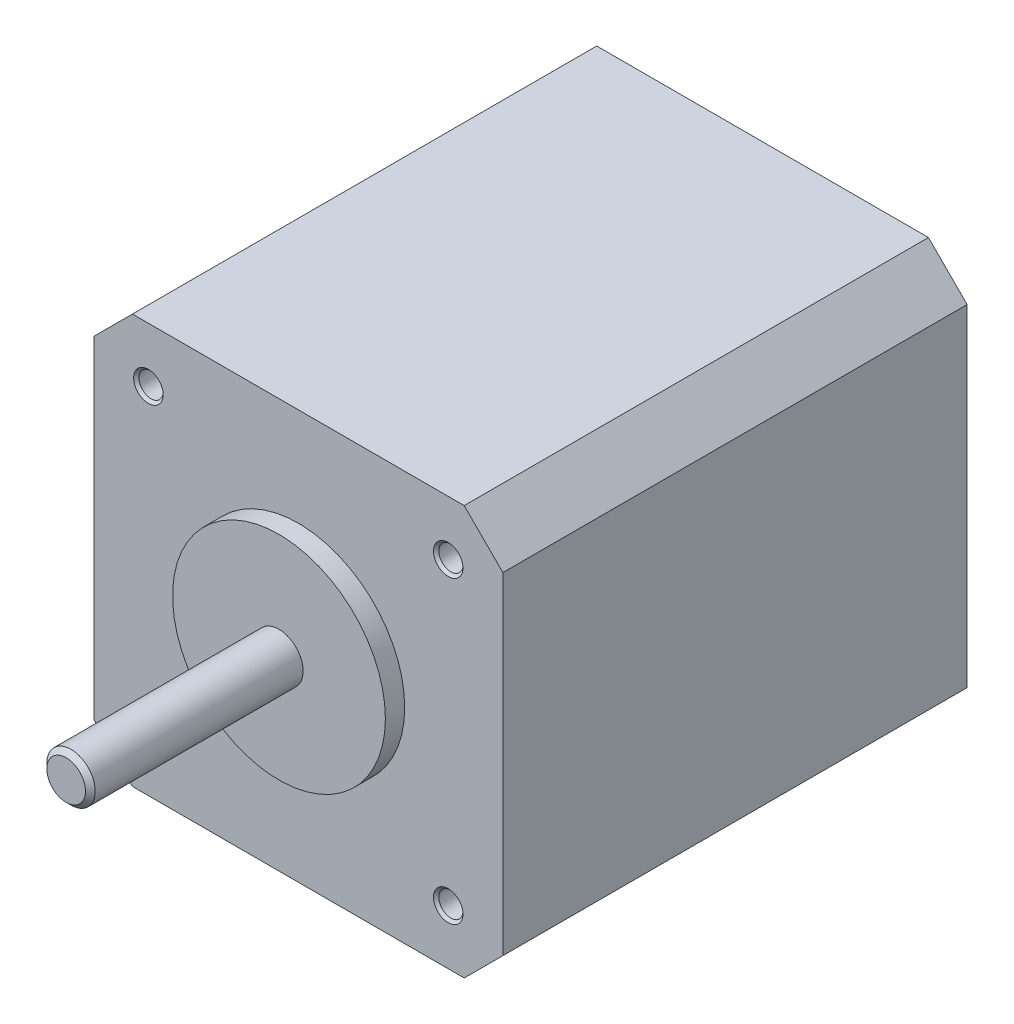
ISO-10303-21;
HEADER;
FILE_DESCRIPTION(('STEP AP214'),'2;1');
FILE_NAME('part.step','',(''),(''),'','','');
FILE_SCHEMA(('AUTOMOTIVE_DESIGN { 1 0 10303 214 1 1 1 1 }'));
ENDSEC;
DATA;
#1=APPLICATION_CONTEXT('core data for automotive mechanical design processes');
#2=APPLICATION_PROTOCOL_DEFINITION('international standard','automotive_design',2000,#1);
#3=PRODUCT_CONTEXT('',#1,'mechanical');
#4=PRODUCT('Part','Part','',(#3));
#5=PRODUCT_RELATED_PRODUCT_CATEGORY('part','',(#4));
#6=PRODUCT_DEFINITION_FORMATION('','',#4);
#7=PRODUCT_DEFINITION_CONTEXT('part definition',#1,'design');
#8=PRODUCT_DEFINITION('design','',#6,#7);
#9=PRODUCT_DEFINITION_SHAPE('','',#8);
#10=(LENGTH_UNIT() NAMED_UNIT(*) SI_UNIT(.MILLI.,.METRE.));
#11=(NAMED_UNIT(*) PLANE_ANGLE_UNIT() SI_UNIT($,.RADIAN.));
#12=(NAMED_UNIT(*) SI_UNIT($,.STERADIAN.) SOLID_ANGLE_UNIT());
#13=UNCERTAINTY_MEASURE_WITH_UNIT(LENGTH_MEASURE(1.E-05),#10,'distance_accuracy_value','');
#14=(GEOMETRIC_REPRESENTATION_CONTEXT(3) GLOBAL_UNCERTAINTY_ASSIGNED_CONTEXT((#13)) GLOBAL_UNIT_ASSIGNED_CONTEXT((#10,
#11,#12)) REPRESENTATION_CONTEXT('',''));
#15=CARTESIAN_POINT('',(0.,0.,0.));
#16=DIRECTION('',(0.,0.,1.));
#17=DIRECTION('',(1.,0.,0.));
#18=AXIS2_PLACEMENT_3D('',#15,#16,#17);
#19=CARTESIAN_POINT('',(-21.15,21.15,48.));
#20=DIRECTION('',(1.,0.,0.));
#21=DIRECTION('',(0.,1.,0.));
#22=AXIS2_PLACEMENT_3D('',#19,#20,#21);
#23=PLANE('',#22);
#24=DIRECTION('',(0.,-1.,0.));
#25=VECTOR('',#24,1.);
#26=CARTESIAN_POINT('',(-21.15,21.15,0.));
#27=LINE('',#26,#25);
#28=CARTESIAN_POINT('',(-21.15,17.15,0.));
#29=VERTEX_POINT('',#28);
#30=CARTESIAN_POINT('',(-21.15,-17.15,0.));
#31=VERTEX_POINT('',#30);
#32=EDGE_CURVE('E164',#29,#31,#27,.T.);
#33=ORIENTED_EDGE('',*,*,#32,.T.);
#34=DIRECTION('',(0.,0.,1.));
#35=VECTOR('',#34,1.);
#36=CARTESIAN_POINT('',(-21.15,-17.15,48.));
#37=LINE('',#36,#35);
#38=CARTESIAN_POINT('',(-21.15,-17.15,48.));
#39=VERTEX_POINT('',#38);
#40=EDGE_CURVE('E209',#31,#39,#37,.T.);
#41=ORIENTED_EDGE('',*,*,#40,.T.);
#42=DIRECTION('',(0.,-1.,0.));
#43=VECTOR('',#42,1.);
#44=CARTESIAN_POINT('',(-21.15,21.15,48.));
#45=LINE('',#44,#43);
#46=CARTESIAN_POINT('',(-21.15,17.15,48.));
#47=VERTEX_POINT('',#46);
#48=EDGE_CURVE('E167',#47,#39,#45,.T.);
#49=ORIENTED_EDGE('',*,*,#48,.F.);
#50=DIRECTION('',(0.,0.,-1.));
#51=VECTOR('',#50,1.);
#52=CARTESIAN_POINT('',(-21.15,17.15,48.));
#53=LINE('',#52,#51);
#54=EDGE_CURVE('E206',#47,#29,#53,.T.);
#55=ORIENTED_EDGE('',*,*,#54,.T.);
#56=EDGE_LOOP('',(#33,#41,#49,#55));
#57=FACE_BOUND('',#56,.T.);
#58=ADVANCED_FACE('F37',(#57),#23,.F.);
#59=CARTESIAN_POINT('',(-21.15,-21.15,48.));
#60=DIRECTION('',(0.,1.,0.));
#61=DIRECTION('',(0.,0.,1.));
#62=AXIS2_PLACEMENT_3D('',#59,#60,#61);
#63=PLANE('',#62);
#64=CARTESIAN_POINT('',(0.,-21.15,8.));
#65=DIRECTION('',(0.,1.,0.));
#66=DIRECTION('',(0.,0.,1.));
#67=AXIS2_PLACEMENT_3D('',#64,#65,#66);
#68=CIRCLE('',#67,2.5);
#69=CARTESIAN_POINT('',(0.,-21.15,10.5));
#70=VERTEX_POINT('',#69);
#71=EDGE_CURVE('E11',#70,#70,#68,.F.);
#72=ORIENTED_EDGE('',*,*,#71,.F.);
#73=EDGE_LOOP('',(#72));
#74=FACE_BOUND('',#73,.T.);
#75=DIRECTION('',(1.,0.,0.));
#76=VECTOR('',#75,1.);
#77=CARTESIAN_POINT('',(-21.15,-21.15,48.));
#78=LINE('',#77,#76);
#79=CARTESIAN_POINT('',(-17.15,-21.15,48.));
#80=VERTEX_POINT('',#79);
#81=CARTESIAN_POINT('',(17.15,-21.15,48.));
#82=VERTEX_POINT('',#81);
#83=EDGE_CURVE('E170',#80,#82,#78,.T.);
#84=ORIENTED_EDGE('',*,*,#83,.F.);
#85=DIRECTION('',(0.,0.,-1.));
#86=VECTOR('',#85,1.);
#87=CARTESIAN_POINT('',(-17.15,-21.15,48.));
#88=LINE('',#87,#86);
#89=CARTESIAN_POINT('',(-17.15,-21.15,0.));
#90=VERTEX_POINT('',#89);
#91=EDGE_CURVE('E195',#80,#90,#88,.T.);
#92=ORIENTED_EDGE('',*,*,#91,.T.);
#93=DIRECTION('',(1.,0.,0.));
#94=VECTOR('',#93,1.);
#95=CARTESIAN_POINT('',(-21.15,-21.15,0.));
#96=LINE('',#95,#94);
#97=CARTESIAN_POINT('',(17.15,-21.15,0.));
#98=VERTEX_POINT('',#97);
#99=EDGE_CURVE('E181',#90,#98,#96,.T.);
#100=ORIENTED_EDGE('',*,*,#99,.T.);
#101=DIRECTION('',(0.,0.,1.));
#102=VECTOR('',#101,1.);
#103=CARTESIAN_POINT('',(17.15,-21.15,48.));
#104=LINE('',#103,#102);
#105=EDGE_CURVE('E193',#98,#82,#104,.T.);
#106=ORIENTED_EDGE('',*,*,#105,.T.);
#107=EDGE_LOOP('',(#84,#92,#100,#106));
#108=FACE_BOUND('',#107,.T.);
#109=ADVANCED_FACE('F248',(#74,#108),#63,.F.);
#110=CARTESIAN_POINT('',(21.15,21.15,48.));
#111=DIRECTION('',(-1.,0.,0.));
#112=DIRECTION('',(0.,-1.,0.));
#113=AXIS2_PLACEMENT_3D('',#110,#111,#112);
#114=PLANE('',#113);
#115=DIRECTION('',(0.,1.,0.));
#116=VECTOR('',#115,1.);
#117=CARTESIAN_POINT('',(21.15,21.15,48.));
#118=LINE('',#117,#116);
#119=CARTESIAN_POINT('',(21.15,-17.15,48.));
#120=VERTEX_POINT('',#119);
#121=CARTESIAN_POINT('',(21.15,17.15,48.));
#122=VERTEX_POINT('',#121);
#123=EDGE_CURVE('E174',#120,#122,#118,.T.);
#124=ORIENTED_EDGE('',*,*,#123,.F.);
#125=DIRECTION('',(0.,0.,-1.));
#126=VECTOR('',#125,1.);
#127=CARTESIAN_POINT('',(21.15,-17.15,48.));
#128=LINE('',#127,#126);
#129=CARTESIAN_POINT('',(21.15,-17.15,0.));
#130=VERTEX_POINT('',#129);
#131=EDGE_CURVE('E220',#120,#130,#128,.T.);
#132=ORIENTED_EDGE('',*,*,#131,.T.);
#133=DIRECTION('',(0.,1.,0.));
#134=VECTOR('',#133,1.);
#135=CARTESIAN_POINT('',(21.15,21.15,0.));
#136=LINE('',#135,#134);
#137=CARTESIAN_POINT('',(21.15,17.15,0.));
#138=VERTEX_POINT('',#137);
#139=EDGE_CURVE('E184',#130,#138,#136,.T.);
#140=ORIENTED_EDGE('',*,*,#139,.T.);
#141=DIRECTION('',(0.,0.,1.));
#142=VECTOR('',#141,1.);
#143=CARTESIAN_POINT('',(21.15,17.15,48.));
#144=LINE('',#143,#142);
#145=EDGE_CURVE('E218',#138,#122,#144,.T.);
#146=ORIENTED_EDGE('',*,*,#145,.T.);
#147=EDGE_LOOP('',(#124,#132,#140,#146));
#148=FACE_BOUND('',#147,.T.);
#149=ADVANCED_FACE('F256',(#148),#114,.F.);
#150=CARTESIAN_POINT('',(-21.15,21.15,48.));
#151=DIRECTION('',(0.,-1.,0.));
#152=DIRECTION('',(0.,0.,-1.));
#153=AXIS2_PLACEMENT_3D('',#150,#151,#152);
#154=PLANE('',#153);
#155=DIRECTION('',(-1.,0.,0.));
#156=VECTOR('',#155,1.);
#157=CARTESIAN_POINT('',(-21.15,21.15,0.));
#158=LINE('',#157,#156);
#159=CARTESIAN_POINT('',(17.15,21.15,0.));
#160=VERTEX_POINT('',#159);
#161=CARTESIAN_POINT('',(-17.15,21.15,0.));
#162=VERTEX_POINT('',#161);
#163=EDGE_CURVE('E171',#160,#162,#158,.T.);
#164=ORIENTED_EDGE('',*,*,#163,.T.);
#165=DIRECTION('',(0.,0.,1.));
#166=VECTOR('',#165,1.);
#167=CARTESIAN_POINT('',(-17.15,21.15,48.));
#168=LINE('',#167,#166);
#169=CARTESIAN_POINT('',(-17.15,21.15,48.));
#170=VERTEX_POINT('',#169);
#171=EDGE_CURVE('E45',#162,#170,#168,.T.);
#172=ORIENTED_EDGE('',*,*,#171,.T.);
#173=DIRECTION('',(-1.,0.,0.));
#174=VECTOR('',#173,1.);
#175=CARTESIAN_POINT('',(-21.15,21.15,48.));
#176=LINE('',#175,#174);
#177=CARTESIAN_POINT('',(17.15,21.15,48.));
#178=VERTEX_POINT('',#177);
#179=EDGE_CURVE('E176',#178,#170,#176,.T.);
#180=ORIENTED_EDGE('',*,*,#179,.F.);
#181=DIRECTION('',(0.,0.,-1.));
#182=VECTOR('',#181,1.);
#183=CARTESIAN_POINT('',(17.15,21.15,48.));
#184=LINE('',#183,#182);
#185=EDGE_CURVE('E223',#178,#160,#184,.T.);
#186=ORIENTED_EDGE('',*,*,#185,.T.);
#187=EDGE_LOOP('',(#164,#172,#180,#186));
#188=FACE_BOUND('',#187,.T.);
#189=ADVANCED_FACE('F227',(#188),#154,.F.);
#190=CARTESIAN_POINT('',(0.,0.,48.));
#191=DIRECTION('',(0.,0.,1.));
#192=DIRECTION('',(1.,0.,0.));
#193=AXIS2_PLACEMENT_3D('',#190,#191,#192);
#194=PLANE('',#193);
#195=CARTESIAN_POINT('',(-15.5,15.5,48.));
#196=DIRECTION('',(0.,0.,1.));
#197=DIRECTION('',(1.,0.,0.));
#198=AXIS2_PLACEMENT_3D('',#195,#196,#197);
#199=CIRCLE('',#198,1.525);
#200=CARTESIAN_POINT('',(-13.975,15.5,48.));
#201=VERTEX_POINT('',#200);
#202=EDGE_CURVE('E130',#201,#201,#199,.T.);
#203=ORIENTED_EDGE('',*,*,#202,.F.);
#204=EDGE_LOOP('',(#203));
#205=FACE_BOUND('',#204,.T.);
#206=CARTESIAN_POINT('',(15.5,15.5,48.));
#207=DIRECTION('',(0.,0.,1.));
#208=DIRECTION('',(1.,0.,0.));
#209=AXIS2_PLACEMENT_3D('',#206,#207,#208);
#210=CIRCLE('',#209,1.525);
#211=CARTESIAN_POINT('',(17.025,15.5,48.));
#212=VERTEX_POINT('',#211);
#213=EDGE_CURVE('E123',#212,#212,#210,.T.);
#214=ORIENTED_EDGE('',*,*,#213,.F.);
#215=EDGE_LOOP('',(#214));
#216=FACE_BOUND('',#215,.T.);
#217=CARTESIAN_POINT('',(15.5,-15.5,48.));
#218=DIRECTION('',(0.,0.,1.));
#219=DIRECTION('',(1.,0.,0.));
#220=AXIS2_PLACEMENT_3D('',#217,#218,#219);
#221=CIRCLE('',#220,1.525);
#222=CARTESIAN_POINT('',(17.025,-15.5,48.));
#223=VERTEX_POINT('',#222);
#224=EDGE_CURVE('E139',#223,#223,#221,.T.);
#225=ORIENTED_EDGE('',*,*,#224,.F.);
#226=EDGE_LOOP('',(#225));
#227=FACE_BOUND('',#226,.T.);
#228=CARTESIAN_POINT('',(-15.5,-15.5,48.));
#229=DIRECTION('',(0.,0.,1.));
#230=DIRECTION('',(1.,0.,0.));
#231=AXIS2_PLACEMENT_3D('',#228,#229,#230);
#232=CIRCLE('',#231,1.525);
#233=CARTESIAN_POINT('',(-13.975,-15.5,48.));
#234=VERTEX_POINT('',#233);
#235=EDGE_CURVE('E148',#234,#234,#232,.T.);
#236=ORIENTED_EDGE('',*,*,#235,.F.);
#237=EDGE_LOOP('',(#236));
#238=FACE_BOUND('',#237,.T.);
#239=CARTESIAN_POINT('',(0.,0.,48.));
#240=DIRECTION('',(0.,0.,1.));
#241=DIRECTION('',(1.,0.,0.));
#242=AXIS2_PLACEMENT_3D('',#239,#240,#241);
#243=CIRCLE('',#242,11.);
#244=CARTESIAN_POINT('',(11.,0.,48.));
#245=VERTEX_POINT('',#244);
#246=EDGE_CURVE('E160',#245,#245,#243,.T.);
#247=ORIENTED_EDGE('',*,*,#246,.F.);
#248=EDGE_LOOP('',(#247));
#249=FACE_BOUND('',#248,.T.);
#250=ORIENTED_EDGE('',*,*,#48,.T.);
#251=DIRECTION('',(-0.707106781186548,0.707106781186548,0.));
#252=VECTOR('',#251,1.);
#253=CARTESIAN_POINT('',(-19.15,-19.15,48.));
#254=LINE('',#253,#252);
#255=EDGE_CURVE('E216',#39,#80,#254,.F.);
#256=ORIENTED_EDGE('',*,*,#255,.T.);
#257=ORIENTED_EDGE('',*,*,#83,.T.);
#258=DIRECTION('',(-0.707106781186548,-0.707106781186548,0.));
#259=VECTOR('',#258,1.);
#260=CARTESIAN_POINT('',(19.15,-19.15,48.));
#261=LINE('',#260,#259);
#262=EDGE_CURVE('E214',#82,#120,#261,.F.);
#263=ORIENTED_EDGE('',*,*,#262,.T.);
#264=ORIENTED_EDGE('',*,*,#123,.T.);
#265=DIRECTION('',(0.707106781186548,-0.707106781186548,0.));
#266=VECTOR('',#265,1.);
#267=CARTESIAN_POINT('',(19.15,19.15,48.));
#268=LINE('',#267,#266);
#269=EDGE_CURVE('E58',#122,#178,#268,.F.);
#270=ORIENTED_EDGE('',*,*,#269,.T.);
#271=ORIENTED_EDGE('',*,*,#179,.T.);
#272=DIRECTION('',(0.707106781186548,0.707106781186548,0.));
#273=VECTOR('',#272,1.);
#274=CARTESIAN_POINT('',(-19.15,19.15,48.));
#275=LINE('',#274,#273);
#276=EDGE_CURVE('E212',#170,#47,#275,.F.);
#277=ORIENTED_EDGE('',*,*,#276,.T.);
#278=EDGE_LOOP('',(#250,#256,#257,#263,#264,#270,#271,#277));
#279=FACE_BOUND('',#278,.T.);
#280=ADVANCED_FACE('F242',(#205,#216,#227,#238,#249,#279),#194,.T.);
#281=CARTESIAN_POINT('',(0.,0.,0.));
#282=DIRECTION('',(0.,0.,1.));
#283=DIRECTION('',(1.,0.,0.));
#284=AXIS2_PLACEMENT_3D('',#281,#282,#283);
#285=PLANE('',#284);
#286=ORIENTED_EDGE('',*,*,#99,.F.);
#287=DIRECTION('',(0.707106781186548,-0.707106781186548,0.));
#288=VECTOR('',#287,1.);
#289=CARTESIAN_POINT('',(-17.15,-21.15,0.));
#290=LINE('',#289,#288);
#291=EDGE_CURVE('E204',#90,#31,#290,.F.);
#292=ORIENTED_EDGE('',*,*,#291,.T.);
#293=ORIENTED_EDGE('',*,*,#32,.F.);
#294=DIRECTION('',(-0.707106781186548,-0.707106781186548,0.));
#295=VECTOR('',#294,1.);
#296=CARTESIAN_POINT('',(-21.15,17.15,0.));
#297=LINE('',#296,#295);
#298=EDGE_CURVE('E200',#29,#162,#297,.F.);
#299=ORIENTED_EDGE('',*,*,#298,.T.);
#300=ORIENTED_EDGE('',*,*,#163,.F.);
#301=DIRECTION('',(-0.707106781186548,0.707106781186548,0.));
#302=VECTOR('',#301,1.);
#303=CARTESIAN_POINT('',(17.15,21.15,0.));
#304=LINE('',#303,#302);
#305=EDGE_CURVE('E198',#160,#138,#304,.F.);
#306=ORIENTED_EDGE('',*,*,#305,.T.);
#307=ORIENTED_EDGE('',*,*,#139,.F.);
#308=DIRECTION('',(0.707106781186548,0.707106781186548,0.));
#309=VECTOR('',#308,1.);
#310=CARTESIAN_POINT('',(21.15,-17.15,0.));
#311=LINE('',#310,#309);
#312=EDGE_CURVE('E202',#130,#98,#311,.F.);
#313=ORIENTED_EDGE('',*,*,#312,.T.);
#314=EDGE_LOOP('',(#286,#292,#293,#299,#300,#306,#307,#313));
#315=FACE_BOUND('',#314,.T.);
#316=ADVANCED_FACE('F231',(#315),#285,.F.);
#317=CARTESIAN_POINT('',(0.,0.,50.));
#318=DIRECTION('',(0.,0.,-1.));
#319=DIRECTION('',(-1.,0.,0.));
#320=AXIS2_PLACEMENT_3D('',#317,#318,#319);
#321=CYLINDRICAL_SURFACE('',#320,11.);
#322=CARTESIAN_POINT('',(0.,0.,50.));
#323=DIRECTION('',(0.,0.,1.));
#324=DIRECTION('',(1.,0.,0.));
#325=AXIS2_PLACEMENT_3D('',#322,#323,#324);
#326=CIRCLE('',#325,11.);
#327=CARTESIAN_POINT('',(11.,0.,50.));
#328=VERTEX_POINT('',#327);
#329=EDGE_CURVE('E161',#328,#328,#326,.T.);
#330=ORIENTED_EDGE('',*,*,#329,.F.);
#331=EDGE_LOOP('',(#330));
#332=FACE_BOUND('',#331,.T.);
#333=ORIENTED_EDGE('',*,*,#246,.T.);
#334=EDGE_LOOP('',(#333));
#335=FACE_BOUND('',#334,.T.);
#336=ADVANCED_FACE('F466',(#332,#335),#321,.T.);
#337=CARTESIAN_POINT('',(0.,0.,50.));
#338=DIRECTION('',(0.,0.,1.));
#339=DIRECTION('',(1.,0.,0.));
#340=AXIS2_PLACEMENT_3D('',#337,#338,#339);
#341=PLANE('',#340);
#342=CARTESIAN_POINT('',(0.,0.,50.));
#343=DIRECTION('',(0.,0.,1.));
#344=DIRECTION('',(1.,0.,0.));
#345=AXIS2_PLACEMENT_3D('',#342,#343,#344);
#346=CIRCLE('',#345,2.5);
#347=CARTESIAN_POINT('',(2.5,0.,50.));
#348=VERTEX_POINT('',#347);
#349=EDGE_CURVE('E157',#348,#348,#346,.T.);
#350=ORIENTED_EDGE('',*,*,#349,.F.);
#351=EDGE_LOOP('',(#350));
#352=FACE_BOUND('',#351,.T.);
#353=ORIENTED_EDGE('',*,*,#329,.T.);
#354=EDGE_LOOP('',(#353));
#355=FACE_BOUND('',#354,.T.);
#356=ADVANCED_FACE('F462',(#352,#355),#341,.T.);
#357=CARTESIAN_POINT('',(0.,0.,72.));
#358=DIRECTION('',(0.,0.,-1.));
#359=DIRECTION('',(-1.,0.,0.));
#360=AXIS2_PLACEMENT_3D('',#357,#358,#359);
#361=CYLINDRICAL_SURFACE('',#360,2.5);
#362=CARTESIAN_POINT('',(0.,0.,71.5));
#363=DIRECTION('',(0.,0.,1.));
#364=DIRECTION('',(1.,0.,0.));
#365=AXIS2_PLACEMENT_3D('',#362,#363,#364);
#366=CIRCLE('',#365,2.5);
#367=CARTESIAN_POINT('',(2.5,0.,71.5));
#368=VERTEX_POINT('',#367);
#369=EDGE_CURVE('E190',#368,#368,#366,.F.);
#370=ORIENTED_EDGE('',*,*,#369,.T.);
#371=EDGE_LOOP('',(#370));
#372=FACE_BOUND('',#371,.T.);
#373=ORIENTED_EDGE('',*,*,#349,.T.);
#374=EDGE_LOOP('',(#373));
#375=FACE_BOUND('',#374,.T.);
#376=ADVANCED_FACE('F458',(#372,#375),#361,.T.);
#377=CARTESIAN_POINT('',(0.,0.,72.));
#378=DIRECTION('',(0.,0.,1.));
#379=DIRECTION('',(1.,0.,0.));
#380=AXIS2_PLACEMENT_3D('',#377,#378,#379);
#381=PLANE('',#380);
#382=CARTESIAN_POINT('',(0.,0.,72.));
#383=DIRECTION('',(0.,0.,1.));
#384=DIRECTION('',(1.,0.,0.));
#385=AXIS2_PLACEMENT_3D('',#382,#383,#384);
#386=CIRCLE('',#385,1.99999999999999);
#387=CARTESIAN_POINT('',(1.99999999999999,0.,72.));
#388=VERTEX_POINT('',#387);
#389=EDGE_CURVE('E178',#388,#388,#386,.T.);
#390=ORIENTED_EDGE('',*,*,#389,.T.);
#391=EDGE_LOOP('',(#390));
#392=FACE_BOUND('',#391,.T.);
#393=ADVANCED_FACE('F279',(#392),#381,.T.);
#394=CARTESIAN_POINT('',(0.,0.,72.));
#395=DIRECTION('',(0.,0.,-1.));
#396=DIRECTION('',(-1.,0.,0.));
#397=AXIS2_PLACEMENT_3D('',#394,#395,#396);
#398=CONICAL_SURFACE('',#397,1.99999999999999,0.78539816339746);
#399=ORIENTED_EDGE('',*,*,#369,.F.);
#400=EDGE_LOOP('',(#399));
#401=FACE_BOUND('',#400,.T.);
#402=ORIENTED_EDGE('',*,*,#389,.F.);
#403=EDGE_LOOP('',(#402));
#404=FACE_BOUND('',#403,.T.);
#405=ADVANCED_FACE('F276',(#401,#404),#398,.T.);
#406=CARTESIAN_POINT('',(-17.15,-21.15,48.));
#407=DIRECTION('',(0.707106781186547,0.707106781186547,0.));
#408=DIRECTION('',(0.,0.,-1.));
#409=AXIS2_PLACEMENT_3D('',#406,#407,#408);
#410=PLANE('',#409);
#411=ORIENTED_EDGE('',*,*,#255,.F.);
#412=ORIENTED_EDGE('',*,*,#40,.F.);
#413=ORIENTED_EDGE('',*,*,#291,.F.);
#414=ORIENTED_EDGE('',*,*,#91,.F.);
#415=EDGE_LOOP('',(#411,#412,#413,#414));
#416=FACE_BOUND('',#415,.T.);
#417=ADVANCED_FACE('F246',(#416),#410,.F.);
#418=CARTESIAN_POINT('',(21.15,-17.15,48.));
#419=DIRECTION('',(-0.707106781186548,0.707106781186548,0.));
#420=DIRECTION('',(0.,0.,-1.));
#421=AXIS2_PLACEMENT_3D('',#418,#419,#420);
#422=PLANE('',#421);
#423=ORIENTED_EDGE('',*,*,#262,.F.);
#424=ORIENTED_EDGE('',*,*,#105,.F.);
#425=ORIENTED_EDGE('',*,*,#312,.F.);
#426=ORIENTED_EDGE('',*,*,#131,.F.);
#427=EDGE_LOOP('',(#423,#424,#425,#426));
#428=FACE_BOUND('',#427,.T.);
#429=ADVANCED_FACE('F253',(#428),#422,.F.);
#430=CARTESIAN_POINT('',(-21.15,17.15,48.));
#431=DIRECTION('',(0.707106781186547,-0.707106781186547,0.));
#432=DIRECTION('',(0.,0.,-1.));
#433=AXIS2_PLACEMENT_3D('',#430,#431,#432);
#434=PLANE('',#433);
#435=ORIENTED_EDGE('',*,*,#276,.F.);
#436=ORIENTED_EDGE('',*,*,#171,.F.);
#437=ORIENTED_EDGE('',*,*,#298,.F.);
#438=ORIENTED_EDGE('',*,*,#54,.F.);
#439=EDGE_LOOP('',(#435,#436,#437,#438));
#440=FACE_BOUND('',#439,.T.);
#441=ADVANCED_FACE('F237',(#440),#434,.F.);
#442=CARTESIAN_POINT('',(17.15,21.15,48.));
#443=DIRECTION('',(-0.707106781186547,-0.707106781186547,0.));
#444=DIRECTION('',(0.,0.,-1.));
#445=AXIS2_PLACEMENT_3D('',#442,#443,#444);
#446=PLANE('',#445);
#447=ORIENTED_EDGE('',*,*,#269,.F.);
#448=ORIENTED_EDGE('',*,*,#145,.F.);
#449=ORIENTED_EDGE('',*,*,#305,.F.);
#450=ORIENTED_EDGE('',*,*,#185,.F.);
#451=EDGE_LOOP('',(#447,#448,#449,#450));
#452=FACE_BOUND('',#451,.T.);
#453=ADVANCED_FACE('F39',(#452),#446,.F.);
#454=CARTESIAN_POINT('',(-15.5,-15.5,43.5));
#455=DIRECTION('',(0.,0.,1.));
#456=DIRECTION('',(1.,0.,0.));
#457=AXIS2_PLACEMENT_3D('',#454,#455,#456);
#458=CONICAL_SURFACE('',#457,1.25,1.02974425867666);
#459=CARTESIAN_POINT('',(-15.5,-15.5,42.7489242262156));
#460=VERTEX_POINT('',#459);
#461=VERTEX_LOOP('',#460);
#462=FACE_BOUND('',#461,.T.);
#463=CARTESIAN_POINT('',(-15.5,-15.5,43.5));
#464=DIRECTION('',(0.,0.,1.));
#465=DIRECTION('',(1.,0.,0.));
#466=AXIS2_PLACEMENT_3D('',#463,#464,#465);
#467=CIRCLE('',#466,1.25);
#468=CARTESIAN_POINT('',(-14.25,-15.5,43.5));
#469=VERTEX_POINT('',#468);
#470=EDGE_CURVE('E154',#469,#469,#467,.T.);
#471=ORIENTED_EDGE('',*,*,#470,.T.);
#472=EDGE_LOOP('',(#471));
#473=FACE_BOUND('',#472,.T.);
#474=ADVANCED_FACE('F259',(#462,#473),#458,.F.);
#475=CARTESIAN_POINT('',(-15.5,-15.5,48.));
#476=DIRECTION('',(0.,0.,1.));
#477=DIRECTION('',(1.,0.,0.));
#478=AXIS2_PLACEMENT_3D('',#475,#476,#477);
#479=CYLINDRICAL_SURFACE('',#478,1.25);
#480=ORIENTED_EDGE('',*,*,#470,.F.);
#481=EDGE_LOOP('',(#480));
#482=FACE_BOUND('',#481,.T.);
#483=CARTESIAN_POINT('',(-15.5,-15.5,47.725));
#484=DIRECTION('',(0.,0.,1.));
#485=DIRECTION('',(1.,0.,0.));
#486=AXIS2_PLACEMENT_3D('',#483,#484,#485);
#487=CIRCLE('',#486,1.25);
#488=CARTESIAN_POINT('',(-14.25,-15.5,47.725));
#489=VERTEX_POINT('',#488);
#490=EDGE_CURVE('E151',#489,#489,#487,.T.);
#491=ORIENTED_EDGE('',*,*,#490,.T.);
#492=EDGE_LOOP('',(#491));
#493=FACE_BOUND('',#492,.T.);
#494=ADVANCED_FACE('F264',(#482,#493),#479,.F.);
#495=CARTESIAN_POINT('',(-15.5,-15.5,48.));
#496=DIRECTION('',(0.,0.,1.));
#497=DIRECTION('',(1.,0.,0.));
#498=AXIS2_PLACEMENT_3D('',#495,#496,#497);
#499=CONICAL_SURFACE('',#498,1.525,0.785398163397442);
#500=ORIENTED_EDGE('',*,*,#490,.F.);
#501=EDGE_LOOP('',(#500));
#502=FACE_BOUND('',#501,.T.);
#503=ORIENTED_EDGE('',*,*,#235,.T.);
#504=EDGE_LOOP('',(#503));
#505=FACE_BOUND('',#504,.T.);
#506=ADVANCED_FACE('F325',(#502,#505),#499,.F.);
#507=CARTESIAN_POINT('',(15.5,-15.5,43.5));
#508=DIRECTION('',(0.,0.,1.));
#509=DIRECTION('',(1.,0.,0.));
#510=AXIS2_PLACEMENT_3D('',#507,#508,#509);
#511=CONICAL_SURFACE('',#510,1.25,1.02974425867666);
#512=CARTESIAN_POINT('',(15.5,-15.5,42.7489242262156));
#513=VERTEX_POINT('',#512);
#514=VERTEX_LOOP('',#513);
#515=FACE_BOUND('',#514,.T.);
#516=CARTESIAN_POINT('',(15.5,-15.5,43.5));
#517=DIRECTION('',(0.,0.,1.));
#518=DIRECTION('',(1.,0.,0.));
#519=AXIS2_PLACEMENT_3D('',#516,#517,#518);
#520=CIRCLE('',#519,1.25);
#521=CARTESIAN_POINT('',(16.75,-15.5,43.5));
#522=VERTEX_POINT('',#521);
#523=EDGE_CURVE('E145',#522,#522,#520,.T.);
#524=ORIENTED_EDGE('',*,*,#523,.T.);
#525=EDGE_LOOP('',(#524));
#526=FACE_BOUND('',#525,.T.);
#527=ADVANCED_FACE('F336',(#515,#526),#511,.F.);
#528=CARTESIAN_POINT('',(15.5,-15.5,48.));
#529=DIRECTION('',(0.,0.,1.));
#530=DIRECTION('',(1.,0.,0.));
#531=AXIS2_PLACEMENT_3D('',#528,#529,#530);
#532=CYLINDRICAL_SURFACE('',#531,1.25);
#533=ORIENTED_EDGE('',*,*,#523,.F.);
#534=EDGE_LOOP('',(#533));
#535=FACE_BOUND('',#534,.T.);
#536=CARTESIAN_POINT('',(15.5,-15.5,47.725));
#537=DIRECTION('',(0.,0.,1.));
#538=DIRECTION('',(1.,0.,0.));
#539=AXIS2_PLACEMENT_3D('',#536,#537,#538);
#540=CIRCLE('',#539,1.25);
#541=CARTESIAN_POINT('',(16.75,-15.5,47.725));
#542=VERTEX_POINT('',#541);
#543=EDGE_CURVE('E142',#542,#542,#540,.T.);
#544=ORIENTED_EDGE('',*,*,#543,.T.);
#545=EDGE_LOOP('',(#544));
#546=FACE_BOUND('',#545,.T.);
#547=ADVANCED_FACE('F346',(#535,#546),#532,.F.);
#548=CARTESIAN_POINT('',(15.5,-15.5,48.));
#549=DIRECTION('',(0.,0.,1.));
#550=DIRECTION('',(1.,0.,0.));
#551=AXIS2_PLACEMENT_3D('',#548,#549,#550);
#552=CONICAL_SURFACE('',#551,1.525,0.785398163397442);
#553=ORIENTED_EDGE('',*,*,#543,.F.);
#554=EDGE_LOOP('',(#553));
#555=FACE_BOUND('',#554,.T.);
#556=ORIENTED_EDGE('',*,*,#224,.T.);
#557=EDGE_LOOP('',(#556));
#558=FACE_BOUND('',#557,.T.);
#559=ADVANCED_FACE('F356',(#555,#558),#552,.F.);
#560=CARTESIAN_POINT('',(15.5,15.5,43.5));
#561=DIRECTION('',(0.,0.,1.));
#562=DIRECTION('',(1.,0.,0.));
#563=AXIS2_PLACEMENT_3D('',#560,#561,#562);
#564=CONICAL_SURFACE('',#563,1.25,1.02974425867666);
#565=CARTESIAN_POINT('',(15.5,15.5,42.7489242262156));
#566=VERTEX_POINT('',#565);
#567=VERTEX_LOOP('',#566);
#568=FACE_BOUND('',#567,.T.);
#569=CARTESIAN_POINT('',(15.5,15.5,43.5));
#570=DIRECTION('',(0.,0.,1.));
#571=DIRECTION('',(1.,0.,0.));
#572=AXIS2_PLACEMENT_3D('',#569,#570,#571);
#573=CIRCLE('',#572,1.25);
#574=CARTESIAN_POINT('',(16.75,15.5,43.5));
#575=VERTEX_POINT('',#574);
#576=EDGE_CURVE('E136',#575,#575,#573,.T.);
#577=ORIENTED_EDGE('',*,*,#576,.T.);
#578=EDGE_LOOP('',(#577));
#579=FACE_BOUND('',#578,.T.);
#580=ADVANCED_FACE('F367',(#568,#579),#564,.F.);
#581=CARTESIAN_POINT('',(15.5,15.5,48.));
#582=DIRECTION('',(0.,0.,1.));
#583=DIRECTION('',(1.,0.,0.));
#584=AXIS2_PLACEMENT_3D('',#581,#582,#583);
#585=CYLINDRICAL_SURFACE('',#584,1.25);
#586=ORIENTED_EDGE('',*,*,#576,.F.);
#587=EDGE_LOOP('',(#586));
#588=FACE_BOUND('',#587,.T.);
#589=CARTESIAN_POINT('',(15.5,15.5,47.725));
#590=DIRECTION('',(0.,0.,1.));
#591=DIRECTION('',(1.,0.,0.));
#592=AXIS2_PLACEMENT_3D('',#589,#590,#591);
#593=CIRCLE('',#592,1.25);
#594=CARTESIAN_POINT('',(16.75,15.5,47.725));
#595=VERTEX_POINT('',#594);
#596=EDGE_CURVE('E127',#595,#595,#593,.T.);
#597=ORIENTED_EDGE('',*,*,#596,.T.);
#598=EDGE_LOOP('',(#597));
#599=FACE_BOUND('',#598,.T.);
#600=ADVANCED_FACE('F377',(#588,#599),#585,.F.);
#601=CARTESIAN_POINT('',(15.5,15.5,48.));
#602=DIRECTION('',(0.,0.,1.));
#603=DIRECTION('',(1.,0.,0.));
#604=AXIS2_PLACEMENT_3D('',#601,#602,#603);
#605=CONICAL_SURFACE('',#604,1.525,0.785398163397442);
#606=ORIENTED_EDGE('',*,*,#596,.F.);
#607=EDGE_LOOP('',(#606));
#608=FACE_BOUND('',#607,.T.);
#609=ORIENTED_EDGE('',*,*,#213,.T.);
#610=EDGE_LOOP('',(#609));
#611=FACE_BOUND('',#610,.T.);
#612=ADVANCED_FACE('F117',(#608,#611),#605,.F.);
#613=CARTESIAN_POINT('',(-15.5,15.5,43.5));
#614=DIRECTION('',(0.,0.,1.));
#615=DIRECTION('',(1.,0.,0.));
#616=AXIS2_PLACEMENT_3D('',#613,#614,#615);
#617=CONICAL_SURFACE('',#616,1.25,1.02974425867666);
#618=CARTESIAN_POINT('',(-15.5,15.5,42.7489242262156));
#619=VERTEX_POINT('',#618);
#620=VERTEX_LOOP('',#619);
#621=FACE_BOUND('',#620,.T.);
#622=CARTESIAN_POINT('',(-15.5,15.5,43.5));
#623=DIRECTION('',(0.,0.,1.));
#624=DIRECTION('',(1.,0.,0.));
#625=AXIS2_PLACEMENT_3D('',#622,#623,#624);
#626=CIRCLE('',#625,1.25);
#627=CARTESIAN_POINT('',(-14.25,15.5,43.5));
#628=VERTEX_POINT('',#627);
#629=EDGE_CURVE('E121',#628,#628,#626,.T.);
#630=ORIENTED_EDGE('',*,*,#629,.T.);
#631=EDGE_LOOP('',(#630));
#632=FACE_BOUND('',#631,.T.);
#633=ADVANCED_FACE('F113',(#621,#632),#617,.F.);
#634=CARTESIAN_POINT('',(-15.5,15.5,48.));
#635=DIRECTION('',(0.,0.,1.));
#636=DIRECTION('',(1.,0.,0.));
#637=AXIS2_PLACEMENT_3D('',#634,#635,#636);
#638=CYLINDRICAL_SURFACE('',#637,1.25);
#639=ORIENTED_EDGE('',*,*,#629,.F.);
#640=EDGE_LOOP('',(#639));
#641=FACE_BOUND('',#640,.T.);
#642=CARTESIAN_POINT('',(-15.5,15.5,47.725));
#643=DIRECTION('',(0.,0.,1.));
#644=DIRECTION('',(1.,0.,0.));
#645=AXIS2_PLACEMENT_3D('',#642,#643,#644);
#646=CIRCLE('',#645,1.25);
#647=CARTESIAN_POINT('',(-14.25,15.5,47.725));
#648=VERTEX_POINT('',#647);
#649=EDGE_CURVE('E124',#648,#648,#646,.T.);
#650=ORIENTED_EDGE('',*,*,#649,.T.);
#651=EDGE_LOOP('',(#650));
#652=FACE_BOUND('',#651,.T.);
#653=ADVANCED_FACE('F116',(#641,#652),#638,.F.);
#654=CARTESIAN_POINT('',(-15.5,15.5,48.));
#655=DIRECTION('',(0.,0.,1.));
#656=DIRECTION('',(1.,0.,0.));
#657=AXIS2_PLACEMENT_3D('',#654,#655,#656);
#658=CONICAL_SURFACE('',#657,1.525,0.785398163397442);
#659=ORIENTED_EDGE('',*,*,#649,.F.);
#660=EDGE_LOOP('',(#659));
#661=FACE_BOUND('',#660,.T.);
#662=ORIENTED_EDGE('',*,*,#202,.T.);
#663=EDGE_LOOP('',(#662));
#664=FACE_BOUND('',#663,.T.);
#665=ADVANCED_FACE('F412',(#661,#664),#658,.F.);
#666=CARTESIAN_POINT('',(0.,-31.15,8.));
#667=DIRECTION('',(0.,1.,0.));
#668=DIRECTION('',(0.,0.,1.));
#669=AXIS2_PLACEMENT_3D('',#666,#667,#668);
#670=CYLINDRICAL_SURFACE('',#669,2.5);
#671=CARTESIAN_POINT('',(0.,-31.15,8.));
#672=DIRECTION('',(0.,-1.,0.));
#673=DIRECTION('',(0.,0.,-1.));
#674=AXIS2_PLACEMENT_3D('',#671,#672,#673);
#675=CIRCLE('',#674,2.5);
#676=CARTESIAN_POINT('',(0.,-31.15,5.5));
#677=VERTEX_POINT('',#676);
#678=EDGE_CURVE('E537',#677,#677,#675,.T.);
#679=ORIENTED_EDGE('',*,*,#678,.F.);
#680=EDGE_LOOP('',(#679));
#681=FACE_BOUND('',#680,.T.);
#682=ORIENTED_EDGE('',*,*,#71,.T.);
#683=EDGE_LOOP('',(#682));
#684=FACE_BOUND('',#683,.T.);
#685=ADVANCED_FACE('F421',(#681,#684),#670,.T.);
#686=CARTESIAN_POINT('',(0.,-31.15,8.));
#687=DIRECTION('',(0.,-1.,0.));
#688=DIRECTION('',(0.,0.,-1.));
#689=AXIS2_PLACEMENT_3D('',#686,#687,#688);
#690=PLANE('',#689);
#691=ORIENTED_EDGE('',*,*,#678,.T.);
#692=EDGE_LOOP('',(#691));
#693=FACE_BOUND('',#692,.T.);
#694=ADVANCED_FACE('F440',(#693),#690,.T.);
#695=CLOSED_SHELL('',(#58,#109,#149,#189,#280,#316,#336,#356,#376,#393,#405,#417,#429,#441,#453,
#474,#494,#506,#527,#547,#559,#580,#600,#612,#633,#653,#665,#685,#694));
#696=MANIFOLD_SOLID_BREP('B2',#695);
#697=ADVANCED_BREP_SHAPE_REPRESENTATION('',(#18,#696),#14);
#698=SHAPE_DEFINITION_REPRESENTATION(#9,#697);
ENDSEC;
END-ISO-10303-21;
